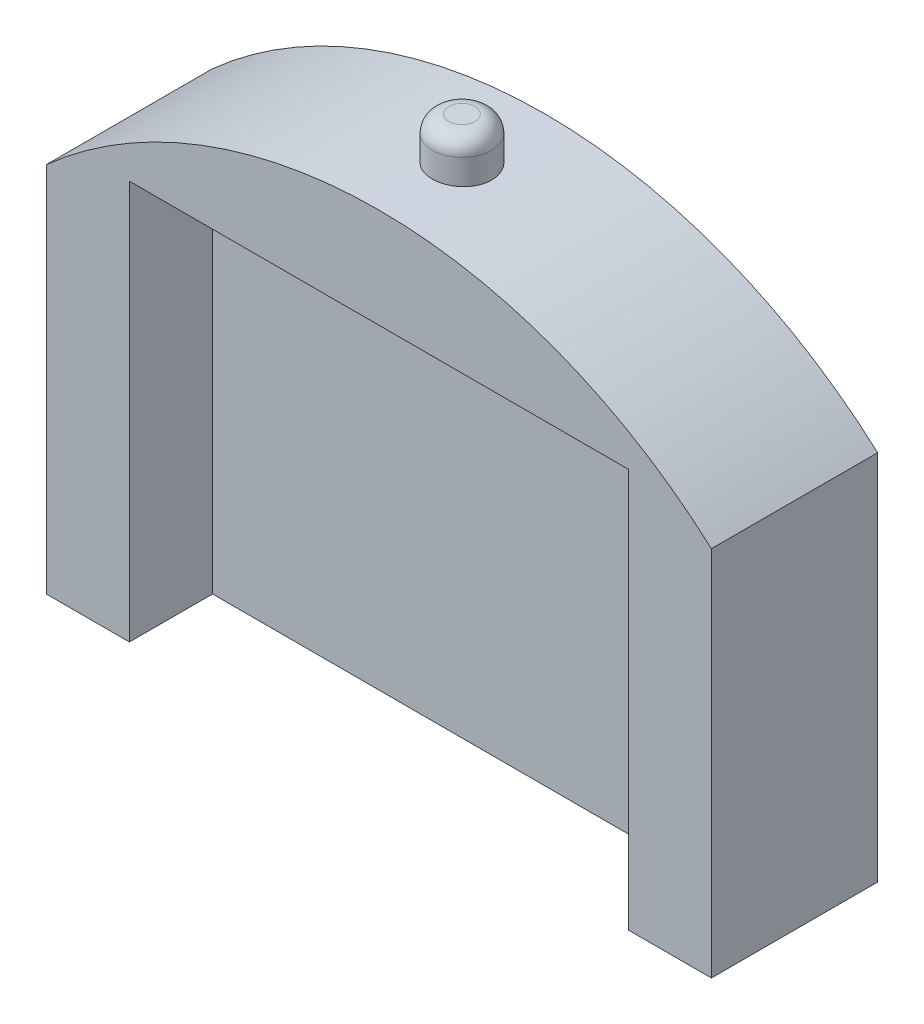
ISO-10303-21;
HEADER;
FILE_DESCRIPTION(('STEP AP214'),'2;1');
FILE_NAME('part.step','',(''),(''),'','','');
FILE_SCHEMA(('AUTOMOTIVE_DESIGN { 1 0 10303 214 1 1 1 1 }'));
ENDSEC;
DATA;
#1=APPLICATION_CONTEXT('core data for automotive mechanical design processes');
#2=APPLICATION_PROTOCOL_DEFINITION('international standard','automotive_design',2000,#1);
#3=PRODUCT_CONTEXT('',#1,'mechanical');
#4=PRODUCT('Part','Part','',(#3));
#5=PRODUCT_RELATED_PRODUCT_CATEGORY('part','',(#4));
#6=PRODUCT_DEFINITION_FORMATION('','',#4);
#7=PRODUCT_DEFINITION_CONTEXT('part definition',#1,'design');
#8=PRODUCT_DEFINITION('design','',#6,#7);
#9=PRODUCT_DEFINITION_SHAPE('','',#8);
#10=(LENGTH_UNIT() NAMED_UNIT(*) SI_UNIT(.MILLI.,.METRE.));
#11=(NAMED_UNIT(*) PLANE_ANGLE_UNIT() SI_UNIT($,.RADIAN.));
#12=(NAMED_UNIT(*) SI_UNIT($,.STERADIAN.) SOLID_ANGLE_UNIT());
#13=UNCERTAINTY_MEASURE_WITH_UNIT(LENGTH_MEASURE(1.E-05),#10,'distance_accuracy_value','');
#14=(GEOMETRIC_REPRESENTATION_CONTEXT(3) GLOBAL_UNCERTAINTY_ASSIGNED_CONTEXT((#13)) GLOBAL_UNIT_ASSIGNED_CONTEXT((#10,
#11,#12)) REPRESENTATION_CONTEXT('',''));
#15=CARTESIAN_POINT('',(0.,0.,0.));
#16=DIRECTION('',(0.,0.,1.));
#17=DIRECTION('',(1.,0.,0.));
#18=AXIS2_PLACEMENT_3D('',#15,#16,#17);
#19=CARTESIAN_POINT('',(-20.,40.,5.));
#20=DIRECTION('',(0.,0.,-1.));
#21=DIRECTION('',(-1.,0.,0.));
#22=AXIS2_PLACEMENT_3D('',#19,#20,#21);
#23=PLANE('',#22);
#24=DIRECTION('',(0.,-1.,0.));
#25=VECTOR('',#24,1.);
#26=CARTESIAN_POINT('',(-15.,0.,5.));
#27=LINE('',#26,#25);
#28=CARTESIAN_POINT('',(-15.,24.,5.));
#29=VERTEX_POINT('',#28);
#30=CARTESIAN_POINT('',(-15.,0.,5.));
#31=VERTEX_POINT('',#30);
#32=EDGE_CURVE('E104',#29,#31,#27,.T.);
#33=ORIENTED_EDGE('',*,*,#32,.F.);
#34=DIRECTION('',(-1.,0.,0.));
#35=VECTOR('',#34,1.);
#36=CARTESIAN_POINT('',(-15.,24.,5.));
#37=LINE('',#36,#35);
#38=CARTESIAN_POINT('',(15.,24.,5.));
#39=VERTEX_POINT('',#38);
#40=EDGE_CURVE('E221',#39,#29,#37,.T.);
#41=ORIENTED_EDGE('',*,*,#40,.F.);
#42=DIRECTION('',(0.,1.,0.));
#43=VECTOR('',#42,1.);
#44=CARTESIAN_POINT('',(15.,0.,5.));
#45=LINE('',#44,#43);
#46=CARTESIAN_POINT('',(15.,0.,5.));
#47=VERTEX_POINT('',#46);
#48=EDGE_CURVE('E114',#47,#39,#45,.T.);
#49=ORIENTED_EDGE('',*,*,#48,.F.);
#50=DIRECTION('',(1.,0.,0.));
#51=VECTOR('',#50,1.);
#52=CARTESIAN_POINT('',(-20.,0.,5.));
#53=LINE('',#52,#51);
#54=CARTESIAN_POINT('',(20.,0.,5.));
#55=VERTEX_POINT('',#54);
#56=EDGE_CURVE('E131',#47,#55,#53,.T.);
#57=ORIENTED_EDGE('',*,*,#56,.T.);
#58=DIRECTION('',(0.,-1.,0.));
#59=VECTOR('',#58,1.);
#60=CARTESIAN_POINT('',(20.,40.,5.));
#61=LINE('',#60,#59);
#62=CARTESIAN_POINT('',(20.,22.3606797749979,5.));
#63=VERTEX_POINT('',#62);
#64=EDGE_CURVE('E130',#63,#55,#61,.T.);
#65=ORIENTED_EDGE('',*,*,#64,.F.);
#66=CARTESIAN_POINT('',(0.,0.,5.));
#67=DIRECTION('',(0.,0.,-1.));
#68=DIRECTION('',(-1.,0.,0.));
#69=AXIS2_PLACEMENT_3D('',#66,#67,#68);
#70=CIRCLE('',#69,30.);
#71=CARTESIAN_POINT('',(-20.,22.3606797749979,5.));
#72=VERTEX_POINT('',#71);
#73=EDGE_CURVE('E205',#72,#63,#70,.T.);
#74=ORIENTED_EDGE('',*,*,#73,.F.);
#75=DIRECTION('',(0.,-1.,0.));
#76=VECTOR('',#75,1.);
#77=CARTESIAN_POINT('',(-20.,40.,5.));
#78=LINE('',#77,#76);
#79=CARTESIAN_POINT('',(-20.,0.,5.));
#80=VERTEX_POINT('',#79);
#81=EDGE_CURVE('E128',#72,#80,#78,.T.);
#82=ORIENTED_EDGE('',*,*,#81,.T.);
#83=EDGE_CURVE('E121',#80,#31,#53,.T.);
#84=ORIENTED_EDGE('',*,*,#83,.T.);
#85=EDGE_LOOP('',(#33,#41,#49,#57,#65,#74,#82,#84));
#86=FACE_BOUND('',#85,.T.);
#87=ADVANCED_FACE('F39',(#86),#23,.F.);
#88=CARTESIAN_POINT('',(0.,0.,0.));
#89=DIRECTION('',(0.,1.,0.));
#90=DIRECTION('',(0.,0.,1.));
#91=AXIS2_PLACEMENT_3D('',#88,#89,#90);
#92=PLANE('',#91);
#93=DIRECTION('',(0.,0.,-1.));
#94=VECTOR('',#93,1.);
#95=CARTESIAN_POINT('',(-15.,0.,5.));
#96=LINE('',#95,#94);
#97=CARTESIAN_POINT('',(-15.,0.,0.));
#98=VERTEX_POINT('',#97);
#99=EDGE_CURVE('E107',#31,#98,#96,.T.);
#100=ORIENTED_EDGE('',*,*,#99,.F.);
#101=ORIENTED_EDGE('',*,*,#83,.F.);
#102=DIRECTION('',(0.,0.,1.));
#103=VECTOR('',#102,1.);
#104=CARTESIAN_POINT('',(-20.,0.,-5.));
#105=LINE('',#104,#103);
#106=CARTESIAN_POINT('',(-20.,0.,-5.));
#107=VERTEX_POINT('',#106);
#108=EDGE_CURVE('E135',#107,#80,#105,.T.);
#109=ORIENTED_EDGE('',*,*,#108,.F.);
#110=DIRECTION('',(-1.,0.,0.));
#111=VECTOR('',#110,1.);
#112=CARTESIAN_POINT('',(-20.,0.,-5.));
#113=LINE('',#112,#111);
#114=CARTESIAN_POINT('',(20.,0.,-5.));
#115=VERTEX_POINT('',#114);
#116=EDGE_CURVE('E210',#115,#107,#113,.T.);
#117=ORIENTED_EDGE('',*,*,#116,.F.);
#118=DIRECTION('',(0.,0.,-1.));
#119=VECTOR('',#118,1.);
#120=CARTESIAN_POINT('',(20.,0.,-5.));
#121=LINE('',#120,#119);
#122=EDGE_CURVE('E203',#55,#115,#121,.T.);
#123=ORIENTED_EDGE('',*,*,#122,.F.);
#124=ORIENTED_EDGE('',*,*,#56,.F.);
#125=DIRECTION('',(0.,0.,-1.));
#126=VECTOR('',#125,1.);
#127=CARTESIAN_POINT('',(15.,0.,5.));
#128=LINE('',#127,#126);
#129=CARTESIAN_POINT('',(15.,0.,0.));
#130=VERTEX_POINT('',#129);
#131=EDGE_CURVE('E125',#47,#130,#128,.T.);
#132=ORIENTED_EDGE('',*,*,#131,.T.);
#133=DIRECTION('',(1.,0.,0.));
#134=VECTOR('',#133,1.);
#135=CARTESIAN_POINT('',(-15.,0.,0.));
#136=LINE('',#135,#134);
#137=EDGE_CURVE('E123',#98,#130,#136,.T.);
#138=ORIENTED_EDGE('',*,*,#137,.F.);
#139=EDGE_LOOP('',(#100,#101,#109,#117,#123,#124,#132,#138));
#140=FACE_BOUND('',#139,.T.);
#141=ADVANCED_FACE('F119',(#140),#92,.F.);
#142=CARTESIAN_POINT('',(0.,0.,5.));
#143=DIRECTION('',(0.,0.,-1.));
#144=DIRECTION('',(-1.,0.,0.));
#145=AXIS2_PLACEMENT_3D('',#142,#143,#144);
#146=CYLINDRICAL_SURFACE('',#145,30.);
#147=DIRECTION('',(0.,0.,-1.));
#148=VECTOR('',#147,1.);
#149=CARTESIAN_POINT('',(20.,22.3606797749979,5.00000000000001));
#150=LINE('',#149,#148);
#151=CARTESIAN_POINT('',(20.,22.3606797749979,-5.));
#152=VERTEX_POINT('',#151);
#153=EDGE_CURVE('E198',#63,#152,#150,.T.);
#154=ORIENTED_EDGE('',*,*,#153,.T.);
#155=CARTESIAN_POINT('',(0.,0.,-5.));
#156=DIRECTION('',(0.,0.,-1.));
#157=DIRECTION('',(-1.,0.,0.));
#158=AXIS2_PLACEMENT_3D('',#155,#156,#157);
#159=CIRCLE('',#158,30.);
#160=CARTESIAN_POINT('',(-20.,22.3606797749979,-5.));
#161=VERTEX_POINT('',#160);
#162=EDGE_CURVE('E150',#161,#152,#159,.T.);
#163=ORIENTED_EDGE('',*,*,#162,.F.);
#164=DIRECTION('',(0.,0.,-1.));
#165=VECTOR('',#164,1.);
#166=CARTESIAN_POINT('',(-20.,22.3606797749979,5.));
#167=LINE('',#166,#165);
#168=EDGE_CURVE('E62',#161,#72,#167,.F.);
#169=ORIENTED_EDGE('',*,*,#168,.T.);
#170=ORIENTED_EDGE('',*,*,#73,.T.);
#171=EDGE_LOOP('',(#154,#163,#169,#170));
#172=FACE_BOUND('',#171,.T.);
#173=CARTESIAN_POINT('',(0.,30.,-1.78207052578913));
#174=CARTESIAN_POINT('',(0.100005069002551,29.999999295147,-1.78206612189828));
#175=CARTESIAN_POINT('',(0.20008040204993,29.9994945994573,-1.77362421389832));
#176=CARTESIAN_POINT('',(0.397468454797598,29.9975297886776,-1.740068549815));
#177=CARTESIAN_POINT('',(0.494777809899209,29.9960685579191,-1.71493532507672));
#178=CARTESIAN_POINT('',(0.683746112293376,29.9923560035398,-1.64872084159713));
#179=CARTESIAN_POINT('',(0.775407984145507,29.9901050929684,-1.6076479190746));
#180=CARTESIAN_POINT('',(0.95051210413081,29.9850664352896,-1.51073327701825));
#181=CARTESIAN_POINT('',(1.03395624413212,29.9822788121816,-1.45489496769887));
#182=CARTESIAN_POINT('',(1.19039448635621,29.9764758768803,-1.32995067909031));
#183=CARTESIAN_POINT('',(1.26337589408532,29.9734602947628,-1.26082881672202));
#184=CARTESIAN_POINT('',(1.39670851945195,29.9675436251398,-1.11131206198552));
#185=CARTESIAN_POINT('',(1.4570592125367,29.9646425423936,-1.03091670166111));
#186=CARTESIAN_POINT('',(1.56345554209944,29.9592799813731,-0.861064285966656));
#187=CARTESIAN_POINT('',(1.60949076327741,29.9568188237198,-0.771600695411333));
#188=CARTESIAN_POINT('',(1.68588269881857,29.9526171088361,-0.586197220650969));
#189=CARTESIAN_POINT('',(1.71623956843621,29.9508765444701,-0.490257400587251));
#190=CARTESIAN_POINT('',(1.76037819476957,29.9483148433673,-0.294746025141729));
#191=CARTESIAN_POINT('',(1.77417965684197,29.9474926136474,-0.19517893299003));
#192=CARTESIAN_POINT('',(1.78487651764573,29.946857029402,0.00486187545183282));
#193=CARTESIAN_POINT('',(1.78177209224834,29.9470436643812,0.105335582299665));
#194=CARTESIAN_POINT('',(1.75876166793438,29.9484037477627,0.304203358767458));
#195=CARTESIAN_POINT('',(1.73887698359213,29.9495759442809,0.402599904386559));
#196=CARTESIAN_POINT('',(1.68290354738198,29.9527730748695,0.594656047409952));
#197=CARTESIAN_POINT('',(1.64681470608894,29.954798013646,0.688315618669349));
#198=CARTESIAN_POINT('',(1.55943314940738,29.9594738644106,0.868307691205019));
#199=CARTESIAN_POINT('',(1.50813075204452,29.9621251748052,0.954635481361109));
#200=CARTESIAN_POINT('',(1.39178539521925,29.9677545710126,1.11746195225266));
#201=CARTESIAN_POINT('',(1.32674229671077,29.9707326601319,1.19396053351095));
#202=CARTESIAN_POINT('',(1.18464176243588,29.9766855501798,1.33508109655411));
#203=CARTESIAN_POINT('',(1.10756587726031,29.9796603388744,1.39968450279094));
#204=CARTESIAN_POINT('',(0.943652391769723,29.9852669404748,1.5150376191862));
#205=CARTESIAN_POINT('',(0.85681478834194,29.9878987532714,1.56578732492703));
#206=CARTESIAN_POINT('',(0.675831707764555,29.9925230084763,1.65199081433699));
#207=CARTESIAN_POINT('',(0.581685901805079,29.9945154220962,1.68744390931145));
#208=CARTESIAN_POINT('',(0.388763845153431,29.9976359586465,1.74203545703247));
#209=CARTESIAN_POINT('',(0.289987643335216,29.9987640906972,1.76117408193783));
#210=CARTESIAN_POINT('',(0.0907698812283783,30.0000277616201,1.78257043003826));
#211=CARTESIAN_POINT('',(-0.00966891125077451,30.0001648107792,1.78485383859525));
#212=CARTESIAN_POINT('',(-0.209502472652178,29.9994348870898,1.77254202636329));
#213=CARTESIAN_POINT('',(-0.308897246472758,29.998567918954,1.75794688480086));
#214=CARTESIAN_POINT('',(-0.503749063074,29.9959285450747,1.7123135400092));
#215=CARTESIAN_POINT('',(-0.599208871679116,29.9941567874394,1.68128710606153));
#216=CARTESIAN_POINT('',(-0.783566326931683,29.9899072025279,1.60368385053089));
#217=CARTESIAN_POINT('',(-0.872463920221991,29.9874293695115,1.55710690252424));
#218=CARTESIAN_POINT('',(-1.04129117579056,29.9820423762775,1.44965928103404));
#219=CARTESIAN_POINT('',(-1.12120989271811,29.9791326994492,1.38877143593323));
#220=CARTESIAN_POINT('',(-1.26970064762882,29.9732112646921,1.25445542220934));
#221=CARTESIAN_POINT('',(-1.33827258437383,29.9701995058527,1.18102714170997));
#222=CARTESIAN_POINT('',(-1.4622101386783,29.9644089983612,1.02360388608872));
#223=CARTESIAN_POINT('',(-1.51755910481002,29.9616305463319,0.939595789090936));
#224=CARTESIAN_POINT('',(-1.61336568941361,29.9566246848117,0.76346362515828));
#225=CARTESIAN_POINT('',(-1.65382339250171,29.9543972721896,0.671339604343994));
#226=CARTESIAN_POINT('',(-1.71867011676772,29.9507468101052,0.48165170954671));
#227=CARTESIAN_POINT('',(-1.74306965447884,29.9493232342952,0.38409144128246));
#228=CARTESIAN_POINT('',(-1.77514179420882,29.9474395181177,0.186250243913658));
#229=CARTESIAN_POINT('',(-1.78281454311514,29.9469793692898,0.0859693387083978));
#230=CARTESIAN_POINT('',(-1.78121390526716,29.947074602873,-0.114300915329781));
#231=CARTESIAN_POINT('',(-1.77196670086381,29.9476284162548,-0.214290475223705));
#232=CARTESIAN_POINT('',(-1.73684289163807,29.9496858412087,-0.41129459422125));
#233=CARTESIAN_POINT('',(-1.71096625622549,29.951189454528,-0.50830914785194));
#234=CARTESIAN_POINT('',(-1.643323893269,29.9549766520844,-0.696613683099792));
#235=CARTESIAN_POINT('',(-1.60155820868212,29.9572602342128,-0.787903680192872));
#236=CARTESIAN_POINT('',(-1.5033271099313,29.9623499712562,-0.962178773239232));
#237=CARTESIAN_POINT('',(-1.44686209534513,29.9651561119657,-1.04516409485695));
#238=CARTESIAN_POINT('',(-1.32073895571646,29.9709797694724,-1.20060657009941));
#239=CARTESIAN_POINT('',(-1.25106203507704,29.9739975835,-1.27304846164172));
#240=CARTESIAN_POINT('',(-1.10051570828119,29.979902057067,-1.4052314998866));
#241=CARTESIAN_POINT('',(-1.01964356389913,29.9827886842894,-1.46496953027412));
#242=CARTESIAN_POINT('',(-0.848918107282335,29.9881082347953,-1.57008874594206));
#243=CARTESIAN_POINT('',(-0.759054470952932,29.9905406271251,-1.61545317256499));
#244=CARTESIAN_POINT('',(-0.573037529432283,29.9946703084778,-1.69039503590213));
#245=CARTESIAN_POINT('',(-0.476891757136134,29.9963684599606,-1.71999100423753));
#246=CARTESIAN_POINT('',(-0.316796080289857,29.9983921937534,-1.7548445688047));
#247=CARTESIAN_POINT('',(-0.25388160632626,29.9989924495741,-1.76504114567741));
#248=CARTESIAN_POINT('',(-0.127320916118619,29.9997965768475,-1.77865552198859));
#249=CARTESIAN_POINT('',(-0.0636747007797221,30.0000004487903,-1.78207332981132));
#250=CARTESIAN_POINT('',(0.,30.,-1.78207052578913));
#251=B_SPLINE_CURVE_WITH_KNOTS('',3,(#173,#174,#175,#176,#177,#178,#179,#180,#181,#182,#183,
#184,#185,#186,#187,#188,#189,#190,#191,#192,#193,#194,#195,#196,#197,#198,#199,#200,#201,#202,
#203,#204,#205,#206,#207,#208,#209,#210,#211,#212,#213,#214,#215,#216,#217,#218,#219,#220,#221,
#222,#223,#224,#225,#226,#227,#228,#229,#230,#231,#232,#233,#234,#235,#236,#237,#238,#239,#240,
#241,#242,#243,#244,#245,#246,#247,#248,#249,#250),.UNSPECIFIED.,.T.,.F.,(4,2,2,2,2,2,2,2,2,2,2,
2,2,2,2,2,2,2,2,2,2,2,2,2,2,2,2,2,2,2,2,2,2,2,2,2,2,2,4),(0.,0.299782760341572,
0.599915801121371,0.899892087968772,1.19979915269976,1.5000670714381,1.80034745781067,
2.10084580642433,2.40134117930424,2.70147852639691,3.00161275117911,3.30136631313671,
3.60112152935078,3.90106792200599,4.20101735004968,4.50143127953276,4.80184530481028,
5.10227285412647,5.40269723313527,5.7026637061252,6.00262877110289,6.30237926939547,
6.60213220468033,6.90224666583747,7.20236380452893,7.50285690589791,7.80334829975665,
8.10364270469393,8.40393447256441,8.70376195451043,9.00358998799697,9.30341721088543,
9.60323628430144,9.90348513235275,10.2038075480727,10.5044788419466,10.8047959930019,
10.9956723292082,11.1865484293305),.UNSPECIFIED.);
#252=CARTESIAN_POINT('',(0.,30.,-1.78207052578913));
#253=VERTEX_POINT('',#252);
#254=EDGE_CURVE('E124',#253,#253,#251,.T.);
#255=ORIENTED_EDGE('',*,*,#254,.T.);
#256=EDGE_LOOP('',(#255));
#257=FACE_BOUND('',#256,.T.);
#258=ADVANCED_FACE('F151',(#172,#257),#146,.T.);
#259=CARTESIAN_POINT('',(20.,40.,-5.));
#260=DIRECTION('',(-1.,0.,0.));
#261=DIRECTION('',(0.,0.,1.));
#262=AXIS2_PLACEMENT_3D('',#259,#260,#261);
#263=PLANE('',#262);
#264=ORIENTED_EDGE('',*,*,#153,.F.);
#265=ORIENTED_EDGE('',*,*,#64,.T.);
#266=ORIENTED_EDGE('',*,*,#122,.T.);
#267=DIRECTION('',(0.,-1.,0.));
#268=VECTOR('',#267,1.);
#269=CARTESIAN_POINT('',(20.,40.,-5.));
#270=LINE('',#269,#268);
#271=EDGE_CURVE('E142',#152,#115,#270,.T.);
#272=ORIENTED_EDGE('',*,*,#271,.F.);
#273=EDGE_LOOP('',(#264,#265,#266,#272));
#274=FACE_BOUND('',#273,.T.);
#275=ADVANCED_FACE('F189',(#274),#263,.F.);
#276=CARTESIAN_POINT('',(-20.,40.,-5.));
#277=DIRECTION('',(0.,0.,1.));
#278=DIRECTION('',(1.,0.,0.));
#279=AXIS2_PLACEMENT_3D('',#276,#277,#278);
#280=PLANE('',#279);
#281=ORIENTED_EDGE('',*,*,#162,.T.);
#282=ORIENTED_EDGE('',*,*,#271,.T.);
#283=ORIENTED_EDGE('',*,*,#116,.T.);
#284=DIRECTION('',(0.,-1.,0.));
#285=VECTOR('',#284,1.);
#286=CARTESIAN_POINT('',(-20.,40.,-5.));
#287=LINE('',#286,#285);
#288=EDGE_CURVE('E140',#161,#107,#287,.T.);
#289=ORIENTED_EDGE('',*,*,#288,.F.);
#290=EDGE_LOOP('',(#281,#282,#283,#289));
#291=FACE_BOUND('',#290,.T.);
#292=ADVANCED_FACE('F186',(#291),#280,.F.);
#293=CARTESIAN_POINT('',(-20.,40.,-5.));
#294=DIRECTION('',(1.,0.,0.));
#295=DIRECTION('',(0.,0.,-1.));
#296=AXIS2_PLACEMENT_3D('',#293,#294,#295);
#297=PLANE('',#296);
#298=ORIENTED_EDGE('',*,*,#168,.F.);
#299=ORIENTED_EDGE('',*,*,#288,.T.);
#300=ORIENTED_EDGE('',*,*,#108,.T.);
#301=ORIENTED_EDGE('',*,*,#81,.F.);
#302=EDGE_LOOP('',(#298,#299,#300,#301));
#303=FACE_BOUND('',#302,.T.);
#304=ADVANCED_FACE('F159',(#303),#297,.F.);
#305=CARTESIAN_POINT('',(0.,32.5,0.));
#306=DIRECTION('',(0.,-1.,0.));
#307=DIRECTION('',(0.,0.,-1.));
#308=AXIS2_PLACEMENT_3D('',#305,#306,#307);
#309=CYLINDRICAL_SURFACE('',#308,1.78207052578913);
#310=CARTESIAN_POINT('',(0.,31.5,0.));
#311=DIRECTION('',(0.,1.,0.));
#312=DIRECTION('',(0.,0.,1.));
#313=AXIS2_PLACEMENT_3D('',#310,#311,#312);
#314=CIRCLE('',#313,1.78207052578913);
#315=CARTESIAN_POINT('',(0.,31.5,1.78207052578913));
#316=VERTEX_POINT('',#315);
#317=EDGE_CURVE('E12',#316,#316,#314,.F.);
#318=ORIENTED_EDGE('',*,*,#317,.T.);
#319=EDGE_LOOP('',(#318));
#320=FACE_BOUND('',#319,.T.);
#321=ORIENTED_EDGE('',*,*,#254,.F.);
#322=EDGE_LOOP('',(#321));
#323=FACE_BOUND('',#322,.T.);
#324=ADVANCED_FACE('F154',(#320,#323),#309,.T.);
#325=CARTESIAN_POINT('',(0.,32.5,0.));
#326=DIRECTION('',(0.,1.,0.));
#327=DIRECTION('',(0.,0.,1.));
#328=AXIS2_PLACEMENT_3D('',#325,#326,#327);
#329=PLANE('',#328);
#330=CARTESIAN_POINT('',(0.,32.5,0.));
#331=DIRECTION('',(0.,1.,0.));
#332=DIRECTION('',(0.,0.,1.));
#333=AXIS2_PLACEMENT_3D('',#330,#331,#332);
#334=CIRCLE('',#333,0.782070525789131);
#335=CARTESIAN_POINT('',(0.,32.5,0.782070525789131));
#336=VERTEX_POINT('',#335);
#337=EDGE_CURVE('E47',#336,#336,#334,.T.);
#338=ORIENTED_EDGE('',*,*,#337,.T.);
#339=EDGE_LOOP('',(#338));
#340=FACE_BOUND('',#339,.T.);
#341=ADVANCED_FACE('F158',(#340),#329,.T.);
#342=CARTESIAN_POINT('',(0.,31.5,0.));
#343=DIRECTION('',(0.,1.,0.));
#344=DIRECTION('',(0.,0.,1.));
#345=AXIS2_PLACEMENT_3D('',#342,#343,#344);
#346=DEGENERATE_TOROIDAL_SURFACE('',#345,0.782070525789131,1.,.T.);
#347=ORIENTED_EDGE('',*,*,#317,.F.);
#348=EDGE_LOOP('',(#347));
#349=FACE_BOUND('',#348,.T.);
#350=ORIENTED_EDGE('',*,*,#337,.F.);
#351=EDGE_LOOP('',(#350));
#352=FACE_BOUND('',#351,.T.);
#353=ADVANCED_FACE('F41',(#349,#352),#346,.T.);
#354=CARTESIAN_POINT('',(-15.,0.,5.));
#355=DIRECTION('',(1.,0.,0.));
#356=DIRECTION('',(0.,0.,-1.));
#357=AXIS2_PLACEMENT_3D('',#354,#355,#356);
#358=PLANE('',#357);
#359=DIRECTION('',(0.,-1.,0.));
#360=VECTOR('',#359,1.);
#361=CARTESIAN_POINT('',(-15.,0.,0.));
#362=LINE('',#361,#360);
#363=CARTESIAN_POINT('',(-15.,24.,0.));
#364=VERTEX_POINT('',#363);
#365=EDGE_CURVE('E54',#364,#98,#362,.T.);
#366=ORIENTED_EDGE('',*,*,#365,.F.);
#367=DIRECTION('',(0.,0.,-1.));
#368=VECTOR('',#367,1.);
#369=CARTESIAN_POINT('',(-15.,24.,5.));
#370=LINE('',#369,#368);
#371=EDGE_CURVE('E110',#29,#364,#370,.T.);
#372=ORIENTED_EDGE('',*,*,#371,.F.);
#373=ORIENTED_EDGE('',*,*,#32,.T.);
#374=ORIENTED_EDGE('',*,*,#99,.T.);
#375=EDGE_LOOP('',(#366,#372,#373,#374));
#376=FACE_BOUND('',#375,.T.);
#377=ADVANCED_FACE('F106',(#376),#358,.T.);
#378=CARTESIAN_POINT('',(15.,0.,5.));
#379=DIRECTION('',(-1.,0.,0.));
#380=DIRECTION('',(0.,0.,1.));
#381=AXIS2_PLACEMENT_3D('',#378,#379,#380);
#382=PLANE('',#381);
#383=DIRECTION('',(0.,1.,0.));
#384=VECTOR('',#383,1.);
#385=CARTESIAN_POINT('',(15.,0.,0.));
#386=LINE('',#385,#384);
#387=CARTESIAN_POINT('',(15.,24.,0.));
#388=VERTEX_POINT('',#387);
#389=EDGE_CURVE('E223',#130,#388,#386,.T.);
#390=ORIENTED_EDGE('',*,*,#389,.F.);
#391=ORIENTED_EDGE('',*,*,#131,.F.);
#392=ORIENTED_EDGE('',*,*,#48,.T.);
#393=DIRECTION('',(0.,0.,-1.));
#394=VECTOR('',#393,1.);
#395=CARTESIAN_POINT('',(15.,24.,5.));
#396=LINE('',#395,#394);
#397=EDGE_CURVE('E217',#39,#388,#396,.T.);
#398=ORIENTED_EDGE('',*,*,#397,.T.);
#399=EDGE_LOOP('',(#390,#391,#392,#398));
#400=FACE_BOUND('',#399,.T.);
#401=ADVANCED_FACE('F166',(#400),#382,.T.);
#402=CARTESIAN_POINT('',(-15.,24.,5.));
#403=DIRECTION('',(0.,-1.,0.));
#404=DIRECTION('',(0.,0.,-1.));
#405=AXIS2_PLACEMENT_3D('',#402,#403,#404);
#406=PLANE('',#405);
#407=DIRECTION('',(-1.,0.,0.));
#408=VECTOR('',#407,1.);
#409=CARTESIAN_POINT('',(-15.,24.,0.));
#410=LINE('',#409,#408);
#411=EDGE_CURVE('E115',#388,#364,#410,.T.);
#412=ORIENTED_EDGE('',*,*,#411,.F.);
#413=ORIENTED_EDGE('',*,*,#397,.F.);
#414=ORIENTED_EDGE('',*,*,#40,.T.);
#415=ORIENTED_EDGE('',*,*,#371,.T.);
#416=EDGE_LOOP('',(#412,#413,#414,#415));
#417=FACE_BOUND('',#416,.T.);
#418=ADVANCED_FACE('F169',(#417),#406,.T.);
#419=CARTESIAN_POINT('',(0.,0.,0.));
#420=DIRECTION('',(0.,0.,-1.));
#421=DIRECTION('',(-1.,0.,0.));
#422=AXIS2_PLACEMENT_3D('',#419,#420,#421);
#423=PLANE('',#422);
#424=ORIENTED_EDGE('',*,*,#365,.T.);
#425=ORIENTED_EDGE('',*,*,#137,.T.);
#426=ORIENTED_EDGE('',*,*,#389,.T.);
#427=ORIENTED_EDGE('',*,*,#411,.T.);
#428=EDGE_LOOP('',(#424,#425,#426,#427));
#429=FACE_BOUND('',#428,.T.);
#430=ADVANCED_FACE('F173',(#429),#423,.F.);
#431=CLOSED_SHELL('',(#87,#141,#258,#275,#292,#304,#324,#341,#353,#377,#401,#418,#430));
#432=MANIFOLD_SOLID_BREP('B2',#431);
#433=ADVANCED_BREP_SHAPE_REPRESENTATION('',(#18,#432),#14);
#434=SHAPE_DEFINITION_REPRESENTATION(#9,#433);
ENDSEC;
END-ISO-10303-21;
